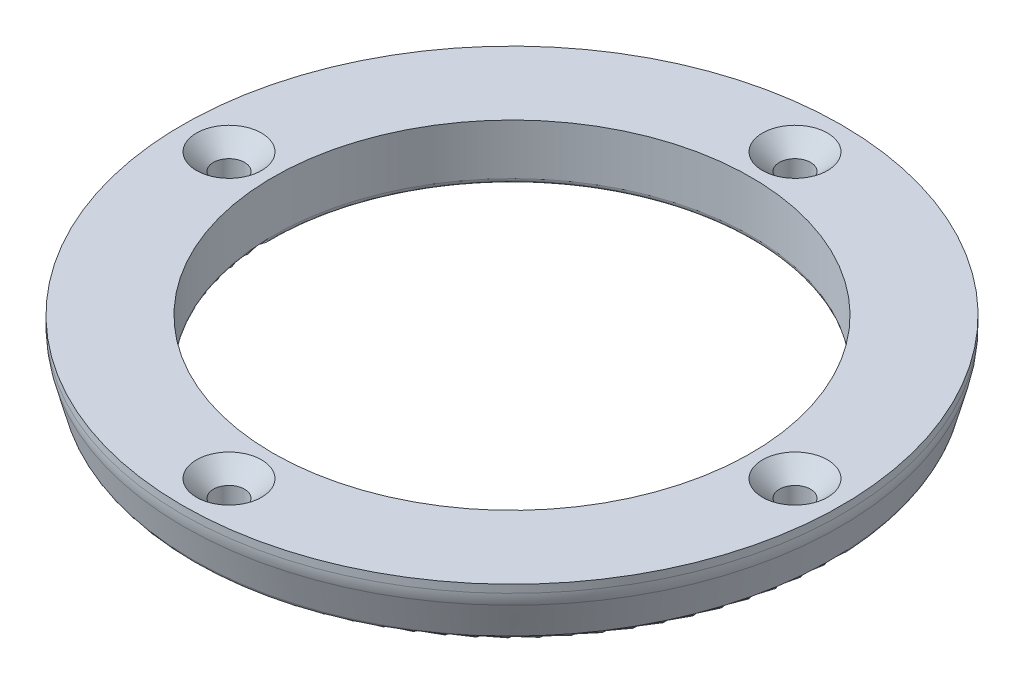
ISO-10303-21;
HEADER;
FILE_DESCRIPTION(('STEP AP214'),'2;1');
FILE_NAME('part.step','',(''),(''),'','','');
FILE_SCHEMA(('AUTOMOTIVE_DESIGN { 1 0 10303 214 1 1 1 1 }'));
ENDSEC;
DATA;
#1=APPLICATION_CONTEXT('core data for automotive mechanical design processes');
#2=APPLICATION_PROTOCOL_DEFINITION('international standard','automotive_design',2000,#1);
#3=PRODUCT_CONTEXT('',#1,'mechanical');
#4=PRODUCT('Part','Part','',(#3));
#5=PRODUCT_RELATED_PRODUCT_CATEGORY('part','',(#4));
#6=PRODUCT_DEFINITION_FORMATION('','',#4);
#7=PRODUCT_DEFINITION_CONTEXT('part definition',#1,'design');
#8=PRODUCT_DEFINITION('design','',#6,#7);
#9=PRODUCT_DEFINITION_SHAPE('','',#8);
#10=(LENGTH_UNIT() NAMED_UNIT(*) SI_UNIT(.MILLI.,.METRE.));
#11=(NAMED_UNIT(*) PLANE_ANGLE_UNIT() SI_UNIT($,.RADIAN.));
#12=(NAMED_UNIT(*) SI_UNIT($,.STERADIAN.) SOLID_ANGLE_UNIT());
#13=UNCERTAINTY_MEASURE_WITH_UNIT(LENGTH_MEASURE(1.E-05),#10,'distance_accuracy_value','');
#14=(GEOMETRIC_REPRESENTATION_CONTEXT(3) GLOBAL_UNCERTAINTY_ASSIGNED_CONTEXT((#13)) GLOBAL_UNIT_ASSIGNED_CONTEXT((#10,
#11,#12)) REPRESENTATION_CONTEXT('',''));
#15=CARTESIAN_POINT('',(0.,0.,0.));
#16=DIRECTION('',(0.,0.,1.));
#17=DIRECTION('',(1.,0.,0.));
#18=AXIS2_PLACEMENT_3D('',#15,#16,#17);
#19=CARTESIAN_POINT('',(0.,8.128,0.));
#20=DIRECTION('',(0.,1.,0.));
#21=DIRECTION('',(0.,0.,1.));
#22=AXIS2_PLACEMENT_3D('',#19,#20,#21);
#23=PLANE('',#22);
#24=CARTESIAN_POINT('',(40.894,8.128,-4.28341913611953E-13));
#25=DIRECTION('',(0.,1.,0.));
#26=DIRECTION('',(0.,0.,1.));
#27=AXIS2_PLACEMENT_3D('',#24,#25,#26);
#28=CIRCLE('',#27,4.7);
#29=CARTESIAN_POINT('',(40.894,8.128,4.69999999999957));
#30=VERTEX_POINT('',#29);
#31=EDGE_CURVE('E100',#30,#30,#28,.T.);
#32=ORIENTED_EDGE('',*,*,#31,.F.);
#33=EDGE_LOOP('',(#32));
#34=FACE_BOUND('',#33,.T.);
#35=CARTESIAN_POINT('',(0.,8.128,40.894));
#36=DIRECTION('',(0.,1.,0.));
#37=DIRECTION('',(0.,0.,1.));
#38=AXIS2_PLACEMENT_3D('',#35,#36,#37);
#39=CIRCLE('',#38,4.7);
#40=CARTESIAN_POINT('',(0.,8.128,45.594));
#41=VERTEX_POINT('',#40);
#42=EDGE_CURVE('E91',#41,#41,#39,.T.);
#43=ORIENTED_EDGE('',*,*,#42,.F.);
#44=EDGE_LOOP('',(#43));
#45=FACE_BOUND('',#44,.T.);
#46=CARTESIAN_POINT('',(-40.894,8.128,1.42780637870651E-13));
#47=DIRECTION('',(0.,1.,0.));
#48=DIRECTION('',(0.,0.,1.));
#49=AXIS2_PLACEMENT_3D('',#46,#47,#48);
#50=CIRCLE('',#49,4.7);
#51=CARTESIAN_POINT('',(-40.894,8.128,4.70000000000015));
#52=VERTEX_POINT('',#51);
#53=EDGE_CURVE('E82',#52,#52,#50,.T.);
#54=ORIENTED_EDGE('',*,*,#53,.F.);
#55=EDGE_LOOP('',(#54));
#56=FACE_BOUND('',#55,.T.);
#57=CARTESIAN_POINT('',(0.,8.128,-40.894));
#58=DIRECTION('',(0.,1.,0.));
#59=DIRECTION('',(0.,0.,1.));
#60=AXIS2_PLACEMENT_3D('',#57,#58,#59);
#61=CIRCLE('',#60,4.7);
#62=CARTESIAN_POINT('',(0.,8.128,-36.194));
#63=VERTEX_POINT('',#62);
#64=EDGE_CURVE('E73',#63,#63,#61,.T.);
#65=ORIENTED_EDGE('',*,*,#64,.F.);
#66=EDGE_LOOP('',(#65));
#67=FACE_BOUND('',#66,.T.);
#68=CARTESIAN_POINT('',(0.,8.128,0.));
#69=DIRECTION('',(0.,1.,0.));
#70=DIRECTION('',(0.,0.,1.));
#71=AXIS2_PLACEMENT_3D('',#68,#69,#70);
#72=CIRCLE('',#71,34.544);
#73=CARTESIAN_POINT('',(0.,8.128,34.544));
#74=VERTEX_POINT('',#73);
#75=EDGE_CURVE('E64',#74,#74,#72,.T.);
#76=ORIENTED_EDGE('',*,*,#75,.F.);
#77=EDGE_LOOP('',(#76));
#78=FACE_BOUND('',#77,.T.);
#79=CARTESIAN_POINT('',(0.,8.128,0.));
#80=DIRECTION('',(0.,1.,0.));
#81=DIRECTION('',(0.,0.,1.));
#82=AXIS2_PLACEMENT_3D('',#79,#80,#81);
#83=CIRCLE('',#82,47.6227243694135);
#84=CARTESIAN_POINT('',(0.,8.128,47.6227243694135));
#85=VERTEX_POINT('',#84);
#86=EDGE_CURVE('E103',#85,#85,#83,.T.);
#87=ORIENTED_EDGE('',*,*,#86,.T.);
#88=EDGE_LOOP('',(#87));
#89=FACE_BOUND('',#88,.T.);
#90=ADVANCED_FACE('F38',(#34,#45,#56,#67,#78,#89),#23,.T.);
#91=CARTESIAN_POINT('',(0.,8.128,0.));
#92=DIRECTION('',(0.,1.,0.));
#93=DIRECTION('',(0.,0.,1.));
#94=AXIS2_PLACEMENT_3D('',#91,#92,#93);
#95=CONICAL_SURFACE('',#94,48.1518910360802,0.26179938779915);
#96=CARTESIAN_POINT('',(0.,0.588312382949874,0.));
#97=DIRECTION('',(0.,1.,0.));
#98=DIRECTION('',(0.,0.,1.));
#99=AXIS2_PLACEMENT_3D('',#96,#97,#98);
#100=CIRCLE('',#99,46.1316378279087);
#101=CARTESIAN_POINT('',(0.,0.588312382949874,46.1316378279087));
#102=VERTEX_POINT('',#101);
#103=EDGE_CURVE('E11',#102,#102,#100,.T.);
#104=ORIENTED_EDGE('',*,*,#103,.T.);
#105=EDGE_LOOP('',(#104));
#106=FACE_BOUND('',#105,.T.);
#107=CARTESIAN_POINT('',(0.,5.34561553760712,0.));
#108=DIRECTION('',(0.,-1.,0.));
#109=DIRECTION('',(0.,0.,-1.));
#110=AXIS2_PLACEMENT_3D('',#107,#108,#109);
#111=CIRCLE('',#110,47.4063533663491);
#112=CARTESIAN_POINT('',(0.,5.34561553760712,-47.4063533663491));
#113=VERTEX_POINT('',#112);
#114=EDGE_CURVE('E61',#113,#113,#111,.T.);
#115=ORIENTED_EDGE('',*,*,#114,.T.);
#116=EDGE_LOOP('',(#115));
#117=FACE_BOUND('',#116,.T.);
#118=ADVANCED_FACE('F126',(#106,#117),#95,.T.);
#119=CARTESIAN_POINT('',(0.,0.,0.));
#120=DIRECTION('',(0.,1.,0.));
#121=DIRECTION('',(0.,0.,1.));
#122=AXIS2_PLACEMENT_3D('',#119,#120,#121);
#123=PLANE('',#122);
#124=CARTESIAN_POINT('',(0.,0.,0.));
#125=DIRECTION('',(0.,1.,0.));
#126=DIRECTION('',(0.,0.,1.));
#127=AXIS2_PLACEMENT_3D('',#124,#125,#126);
#128=CIRCLE('',#127,35.33775);
#129=CARTESIAN_POINT('',(0.,0.,35.33775));
#130=VERTEX_POINT('',#129);
#131=EDGE_CURVE('E49',#130,#130,#128,.T.);
#132=ORIENTED_EDGE('',*,*,#131,.T.);
#133=EDGE_LOOP('',(#132));
#134=FACE_BOUND('',#133,.T.);
#135=CARTESIAN_POINT('',(0.,0.,0.));
#136=DIRECTION('',(0.,1.,0.));
#137=DIRECTION('',(0.,0.,1.));
#138=AXIS2_PLACEMENT_3D('',#135,#136,#137);
#139=CIRCLE('',#138,45.3649342032917);
#140=CARTESIAN_POINT('',(0.,0.,45.3649342032917));
#141=VERTEX_POINT('',#140);
#142=EDGE_CURVE('E53',#141,#141,#139,.F.);
#143=ORIENTED_EDGE('',*,*,#142,.T.);
#144=EDGE_LOOP('',(#143));
#145=FACE_BOUND('',#144,.T.);
#146=CARTESIAN_POINT('',(0.,0.,-40.894));
#147=DIRECTION('',(0.,1.,0.));
#148=DIRECTION('',(0.,0.,1.));
#149=AXIS2_PLACEMENT_3D('',#146,#147,#148);
#150=CIRCLE('',#149,2.25);
#151=CARTESIAN_POINT('',(0.,0.,-38.644));
#152=VERTEX_POINT('',#151);
#153=EDGE_CURVE('E67',#152,#152,#150,.T.);
#154=ORIENTED_EDGE('',*,*,#153,.T.);
#155=EDGE_LOOP('',(#154));
#156=FACE_BOUND('',#155,.T.);
#157=CARTESIAN_POINT('',(-40.894,0.,1.42780637870651E-13));
#158=DIRECTION('',(0.,1.,0.));
#159=DIRECTION('',(0.,0.,1.));
#160=AXIS2_PLACEMENT_3D('',#157,#158,#159);
#161=CIRCLE('',#160,2.25);
#162=CARTESIAN_POINT('',(-40.894,0.,2.25000000000014));
#163=VERTEX_POINT('',#162);
#164=EDGE_CURVE('E76',#163,#163,#161,.T.);
#165=ORIENTED_EDGE('',*,*,#164,.T.);
#166=EDGE_LOOP('',(#165));
#167=FACE_BOUND('',#166,.T.);
#168=CARTESIAN_POINT('',(0.,0.,40.894));
#169=DIRECTION('',(0.,1.,0.));
#170=DIRECTION('',(0.,0.,1.));
#171=AXIS2_PLACEMENT_3D('',#168,#169,#170);
#172=CIRCLE('',#171,2.25);
#173=CARTESIAN_POINT('',(0.,0.,43.144));
#174=VERTEX_POINT('',#173);
#175=EDGE_CURVE('E85',#174,#174,#172,.T.);
#176=ORIENTED_EDGE('',*,*,#175,.T.);
#177=EDGE_LOOP('',(#176));
#178=FACE_BOUND('',#177,.T.);
#179=CARTESIAN_POINT('',(40.894,0.,-4.28341913611953E-13));
#180=DIRECTION('',(0.,1.,0.));
#181=DIRECTION('',(0.,0.,1.));
#182=AXIS2_PLACEMENT_3D('',#179,#180,#181);
#183=CIRCLE('',#182,2.25);
#184=CARTESIAN_POINT('',(40.894,0.,2.24999999999957));
#185=VERTEX_POINT('',#184);
#186=EDGE_CURVE('E94',#185,#185,#183,.T.);
#187=ORIENTED_EDGE('',*,*,#186,.T.);
#188=EDGE_LOOP('',(#187));
#189=FACE_BOUND('',#188,.T.);
#190=ADVANCED_FACE('F132',(#134,#145,#156,#167,#178,#189),#123,.F.);
#191=CARTESIAN_POINT('',(0.,8.128,0.));
#192=DIRECTION('',(0.,-1.,0.));
#193=DIRECTION('',(0.,0.,-1.));
#194=AXIS2_PLACEMENT_3D('',#191,#192,#193);
#195=CYLINDRICAL_SURFACE('',#194,34.544);
#196=CARTESIAN_POINT('',(0.,0.79375,0.));
#197=DIRECTION('',(0.,1.,0.));
#198=DIRECTION('',(0.,0.,1.));
#199=AXIS2_PLACEMENT_3D('',#196,#197,#198);
#200=CIRCLE('',#199,34.544);
#201=CARTESIAN_POINT('',(0.,0.79375,34.544));
#202=VERTEX_POINT('',#201);
#203=EDGE_CURVE('E45',#202,#202,#200,.F.);
#204=ORIENTED_EDGE('',*,*,#203,.T.);
#205=EDGE_LOOP('',(#204));
#206=FACE_BOUND('',#205,.T.);
#207=ORIENTED_EDGE('',*,*,#75,.T.);
#208=EDGE_LOOP('',(#207));
#209=FACE_BOUND('',#208,.T.);
#210=ADVANCED_FACE('F137',(#206,#209),#195,.F.);
#211=CARTESIAN_POINT('',(0.,8.128,-40.894));
#212=DIRECTION('',(0.,1.,0.));
#213=DIRECTION('',(0.,0.,1.));
#214=AXIS2_PLACEMENT_3D('',#211,#212,#213);
#215=CYLINDRICAL_SURFACE('',#214,2.25);
#216=ORIENTED_EDGE('',*,*,#153,.F.);
#217=EDGE_LOOP('',(#216));
#218=FACE_BOUND('',#217,.T.);
#219=CARTESIAN_POINT('',(0.,5.678,-40.894));
#220=DIRECTION('',(0.,1.,0.));
#221=DIRECTION('',(0.,0.,1.));
#222=AXIS2_PLACEMENT_3D('',#219,#220,#221);
#223=CIRCLE('',#222,2.25);
#224=CARTESIAN_POINT('',(0.,5.678,-38.644));
#225=VERTEX_POINT('',#224);
#226=EDGE_CURVE('E70',#225,#225,#223,.T.);
#227=ORIENTED_EDGE('',*,*,#226,.T.);
#228=EDGE_LOOP('',(#227));
#229=FACE_BOUND('',#228,.T.);
#230=ADVANCED_FACE('F186',(#218,#229),#215,.F.);
#231=CARTESIAN_POINT('',(0.,8.128,-40.894));
#232=DIRECTION('',(0.,1.,0.));
#233=DIRECTION('',(0.,0.,1.));
#234=AXIS2_PLACEMENT_3D('',#231,#232,#233);
#235=CONICAL_SURFACE('',#234,4.7,0.785398163397448);
#236=ORIENTED_EDGE('',*,*,#226,.F.);
#237=EDGE_LOOP('',(#236));
#238=FACE_BOUND('',#237,.T.);
#239=ORIENTED_EDGE('',*,*,#64,.T.);
#240=EDGE_LOOP('',(#239));
#241=FACE_BOUND('',#240,.T.);
#242=ADVANCED_FACE('F183',(#238,#241),#235,.F.);
#243=CARTESIAN_POINT('',(-40.894,8.128,1.42780637870651E-13));
#244=DIRECTION('',(0.,1.,0.));
#245=DIRECTION('',(0.,0.,1.));
#246=AXIS2_PLACEMENT_3D('',#243,#244,#245);
#247=CYLINDRICAL_SURFACE('',#246,2.25);
#248=ORIENTED_EDGE('',*,*,#164,.F.);
#249=EDGE_LOOP('',(#248));
#250=FACE_BOUND('',#249,.T.);
#251=CARTESIAN_POINT('',(-40.894,5.678,1.42780637870651E-13));
#252=DIRECTION('',(0.,1.,0.));
#253=DIRECTION('',(0.,0.,1.));
#254=AXIS2_PLACEMENT_3D('',#251,#252,#253);
#255=CIRCLE('',#254,2.25);
#256=CARTESIAN_POINT('',(-40.894,5.678,2.25000000000014));
#257=VERTEX_POINT('',#256);
#258=EDGE_CURVE('E79',#257,#257,#255,.T.);
#259=ORIENTED_EDGE('',*,*,#258,.T.);
#260=EDGE_LOOP('',(#259));
#261=FACE_BOUND('',#260,.T.);
#262=ADVANCED_FACE('F179',(#250,#261),#247,.F.);
#263=CARTESIAN_POINT('',(-40.894,8.128,1.42780637870651E-13));
#264=DIRECTION('',(0.,1.,0.));
#265=DIRECTION('',(0.,0.,1.));
#266=AXIS2_PLACEMENT_3D('',#263,#264,#265);
#267=CONICAL_SURFACE('',#266,4.7,0.785398163397448);
#268=ORIENTED_EDGE('',*,*,#258,.F.);
#269=EDGE_LOOP('',(#268));
#270=FACE_BOUND('',#269,.T.);
#271=ORIENTED_EDGE('',*,*,#53,.T.);
#272=EDGE_LOOP('',(#271));
#273=FACE_BOUND('',#272,.T.);
#274=ADVANCED_FACE('F175',(#270,#273),#267,.F.);
#275=CARTESIAN_POINT('',(0.,8.128,40.894));
#276=DIRECTION('',(0.,1.,0.));
#277=DIRECTION('',(0.,0.,1.));
#278=AXIS2_PLACEMENT_3D('',#275,#276,#277);
#279=CYLINDRICAL_SURFACE('',#278,2.25);
#280=ORIENTED_EDGE('',*,*,#175,.F.);
#281=EDGE_LOOP('',(#280));
#282=FACE_BOUND('',#281,.T.);
#283=CARTESIAN_POINT('',(0.,5.678,40.894));
#284=DIRECTION('',(0.,1.,0.));
#285=DIRECTION('',(0.,0.,1.));
#286=AXIS2_PLACEMENT_3D('',#283,#284,#285);
#287=CIRCLE('',#286,2.25);
#288=CARTESIAN_POINT('',(0.,5.678,43.144));
#289=VERTEX_POINT('',#288);
#290=EDGE_CURVE('E88',#289,#289,#287,.T.);
#291=ORIENTED_EDGE('',*,*,#290,.T.);
#292=EDGE_LOOP('',(#291));
#293=FACE_BOUND('',#292,.T.);
#294=ADVANCED_FACE('F169',(#282,#293),#279,.F.);
#295=CARTESIAN_POINT('',(0.,8.128,40.894));
#296=DIRECTION('',(0.,1.,0.));
#297=DIRECTION('',(0.,0.,1.));
#298=AXIS2_PLACEMENT_3D('',#295,#296,#297);
#299=CONICAL_SURFACE('',#298,4.7,0.785398163397448);
#300=ORIENTED_EDGE('',*,*,#290,.F.);
#301=EDGE_LOOP('',(#300));
#302=FACE_BOUND('',#301,.T.);
#303=ORIENTED_EDGE('',*,*,#42,.T.);
#304=EDGE_LOOP('',(#303));
#305=FACE_BOUND('',#304,.T.);
#306=ADVANCED_FACE('F162',(#302,#305),#299,.F.);
#307=CARTESIAN_POINT('',(40.894,8.128,-4.28341913611953E-13));
#308=DIRECTION('',(0.,1.,0.));
#309=DIRECTION('',(0.,0.,1.));
#310=AXIS2_PLACEMENT_3D('',#307,#308,#309);
#311=CYLINDRICAL_SURFACE('',#310,2.25);
#312=ORIENTED_EDGE('',*,*,#186,.F.);
#313=EDGE_LOOP('',(#312));
#314=FACE_BOUND('',#313,.T.);
#315=CARTESIAN_POINT('',(40.894,5.678,-4.28341913611953E-13));
#316=DIRECTION('',(0.,1.,0.));
#317=DIRECTION('',(0.,0.,1.));
#318=AXIS2_PLACEMENT_3D('',#315,#316,#317);
#319=CIRCLE('',#318,2.25);
#320=CARTESIAN_POINT('',(40.894,5.678,2.24999999999957));
#321=VERTEX_POINT('',#320);
#322=EDGE_CURVE('E97',#321,#321,#319,.T.);
#323=ORIENTED_EDGE('',*,*,#322,.T.);
#324=EDGE_LOOP('',(#323));
#325=FACE_BOUND('',#324,.T.);
#326=ADVANCED_FACE('F121',(#314,#325),#311,.F.);
#327=CARTESIAN_POINT('',(40.894,8.128,-4.28341913611953E-13));
#328=DIRECTION('',(0.,1.,0.));
#329=DIRECTION('',(0.,0.,1.));
#330=AXIS2_PLACEMENT_3D('',#327,#328,#329);
#331=CONICAL_SURFACE('',#330,4.7,0.785398163397448);
#332=ORIENTED_EDGE('',*,*,#322,.F.);
#333=EDGE_LOOP('',(#332));
#334=FACE_BOUND('',#333,.T.);
#335=ORIENTED_EDGE('',*,*,#31,.T.);
#336=EDGE_LOOP('',(#335));
#337=FACE_BOUND('',#336,.T.);
#338=ADVANCED_FACE('F111',(#334,#337),#331,.F.);
#339=CARTESIAN_POINT('',(0.,0.,0.));
#340=DIRECTION('',(0.,1.,0.));
#341=DIRECTION('',(0.,0.,1.));
#342=AXIS2_PLACEMENT_3D('',#339,#340,#341);
#343=CYLINDRICAL_SURFACE('',#342,47.6227243694135);
#344=CARTESIAN_POINT('',(0.,6.98911647400812,0.));
#345=DIRECTION('',(0.,1.,0.));
#346=DIRECTION('',(0.,0.,1.));
#347=AXIS2_PLACEMENT_3D('',#344,#345,#346);
#348=CIRCLE('',#347,47.6227243694135);
#349=CARTESIAN_POINT('',(0.,6.98911647400812,47.6227243694135));
#350=VERTEX_POINT('',#349);
#351=EDGE_CURVE('E58',#350,#350,#348,.T.);
#352=ORIENTED_EDGE('',*,*,#351,.T.);
#353=EDGE_LOOP('',(#352));
#354=FACE_BOUND('',#353,.T.);
#355=ORIENTED_EDGE('',*,*,#86,.F.);
#356=EDGE_LOOP('',(#355));
#357=FACE_BOUND('',#356,.T.);
#358=ADVANCED_FACE('F108',(#354,#357),#343,.T.);
#359=CARTESIAN_POINT('',(0.,6.98911647400812,0.));
#360=DIRECTION('',(0.,1.,0.));
#361=DIRECTION('',(0.,0.,1.));
#362=AXIS2_PLACEMENT_3D('',#359,#360,#361);
#363=TOROIDAL_SURFACE('',#362,41.2727243694135,6.35);
#364=ORIENTED_EDGE('',*,*,#351,.F.);
#365=EDGE_LOOP('',(#364));
#366=FACE_BOUND('',#365,.T.);
#367=ORIENTED_EDGE('',*,*,#114,.F.);
#368=EDGE_LOOP('',(#367));
#369=FACE_BOUND('',#368,.T.);
#370=ADVANCED_FACE('F110',(#366,#369),#363,.T.);
#371=CARTESIAN_POINT('',(0.,0.79375,0.));
#372=DIRECTION('',(0.,1.,0.));
#373=DIRECTION('',(0.,0.,1.));
#374=AXIS2_PLACEMENT_3D('',#371,#372,#373);
#375=TOROIDAL_SURFACE('',#374,35.33775,0.79375);
#376=ORIENTED_EDGE('',*,*,#203,.F.);
#377=EDGE_LOOP('',(#376));
#378=FACE_BOUND('',#377,.T.);
#379=ORIENTED_EDGE('',*,*,#131,.F.);
#380=EDGE_LOOP('',(#379));
#381=FACE_BOUND('',#380,.T.);
#382=ADVANCED_FACE('F118',(#378,#381),#375,.T.);
#383=CARTESIAN_POINT('',(0.,0.79375,0.));
#384=DIRECTION('',(0.,1.,0.));
#385=DIRECTION('',(0.,0.,1.));
#386=AXIS2_PLACEMENT_3D('',#383,#384,#385);
#387=TOROIDAL_SURFACE('',#386,45.3649342032917,0.79375);
#388=ORIENTED_EDGE('',*,*,#142,.F.);
#389=EDGE_LOOP('',(#388));
#390=FACE_BOUND('',#389,.T.);
#391=ORIENTED_EDGE('',*,*,#103,.F.);
#392=EDGE_LOOP('',(#391));
#393=FACE_BOUND('',#392,.T.);
#394=ADVANCED_FACE('F40',(#390,#393),#387,.T.);
#395=CLOSED_SHELL('',(#90,#118,#190,#210,#230,#242,#262,#274,#294,#306,#326,#338,#358,#370,#382,#394));
#396=MANIFOLD_SOLID_BREP('B2',#395);
#397=ADVANCED_BREP_SHAPE_REPRESENTATION('',(#18,#396),#14);
#398=SHAPE_DEFINITION_REPRESENTATION(#9,#397);
ENDSEC;
END-ISO-10303-21;
